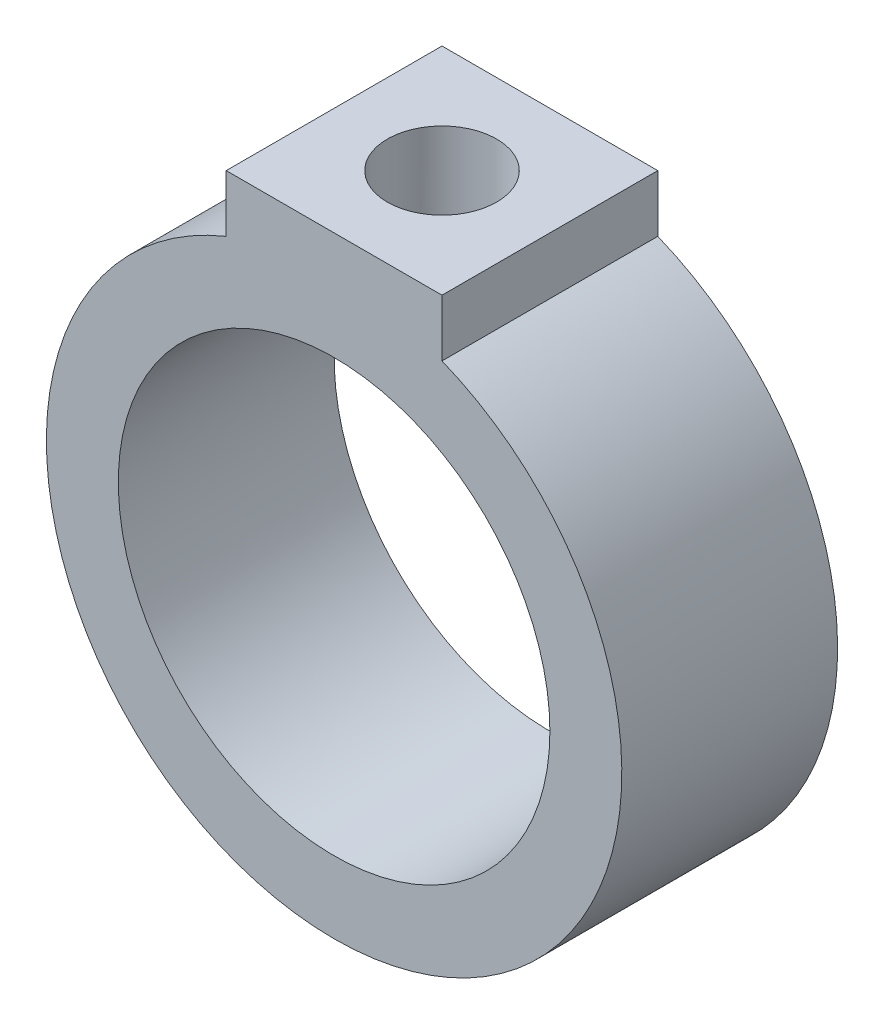
ISO-10303-21;
HEADER;
FILE_DESCRIPTION(('STEP AP214'),'2;1');
FILE_NAME('part.step','',(''),(''),'','','');
FILE_SCHEMA(('AUTOMOTIVE_DESIGN { 1 0 10303 214 1 1 1 1 }'));
ENDSEC;
DATA;
#1=APPLICATION_CONTEXT('core data for automotive mechanical design processes');
#2=APPLICATION_PROTOCOL_DEFINITION('international standard','automotive_design',2000,#1);
#3=PRODUCT_CONTEXT('',#1,'mechanical');
#4=PRODUCT('Part','Part','',(#3));
#5=PRODUCT_RELATED_PRODUCT_CATEGORY('part','',(#4));
#6=PRODUCT_DEFINITION_FORMATION('','',#4);
#7=PRODUCT_DEFINITION_CONTEXT('part definition',#1,'design');
#8=PRODUCT_DEFINITION('design','',#6,#7);
#9=PRODUCT_DEFINITION_SHAPE('','',#8);
#10=(LENGTH_UNIT() NAMED_UNIT(*) SI_UNIT(.MILLI.,.METRE.));
#11=(NAMED_UNIT(*) PLANE_ANGLE_UNIT() SI_UNIT($,.RADIAN.));
#12=(NAMED_UNIT(*) SI_UNIT($,.STERADIAN.) SOLID_ANGLE_UNIT());
#13=UNCERTAINTY_MEASURE_WITH_UNIT(LENGTH_MEASURE(1.E-05),#10,'distance_accuracy_value','');
#14=(GEOMETRIC_REPRESENTATION_CONTEXT(3) GLOBAL_UNCERTAINTY_ASSIGNED_CONTEXT((#13)) GLOBAL_UNIT_ASSIGNED_CONTEXT((#10,
#11,#12)) REPRESENTATION_CONTEXT('',''));
#15=CARTESIAN_POINT('',(0.,0.,0.));
#16=DIRECTION('',(0.,0.,1.));
#17=DIRECTION('',(1.,0.,0.));
#18=AXIS2_PLACEMENT_3D('',#15,#16,#17);
#19=CARTESIAN_POINT('',(0.,0.,9.525));
#20=DIRECTION('',(0.,0.,-1.));
#21=DIRECTION('',(-1.,0.,0.));
#22=AXIS2_PLACEMENT_3D('',#19,#20,#21);
#23=CYLINDRICAL_SURFACE('',#22,25.4);
#24=DIRECTION('',(0.,0.,-1.));
#25=VECTOR('',#24,1.);
#26=CARTESIAN_POINT('',(9.525,23.5464301965287,9.525));
#27=LINE('',#26,#25);
#28=CARTESIAN_POINT('',(9.525,23.5464301965287,9.525));
#29=VERTEX_POINT('',#28);
#30=CARTESIAN_POINT('',(9.525,23.5464301965287,-9.525));
#31=VERTEX_POINT('',#30);
#32=EDGE_CURVE('E102',#29,#31,#27,.T.);
#33=ORIENTED_EDGE('',*,*,#32,.F.);
#34=CARTESIAN_POINT('',(0.,0.,9.525));
#35=DIRECTION('',(0.,0.,1.));
#36=DIRECTION('',(1.,0.,0.));
#37=AXIS2_PLACEMENT_3D('',#34,#35,#36);
#38=CIRCLE('',#37,25.4);
#39=CARTESIAN_POINT('',(-9.525,23.5464301965287,9.525));
#40=VERTEX_POINT('',#39);
#41=EDGE_CURVE('E11',#40,#29,#38,.T.);
#42=ORIENTED_EDGE('',*,*,#41,.F.);
#43=DIRECTION('',(0.,0.,-1.));
#44=VECTOR('',#43,1.);
#45=CARTESIAN_POINT('',(-9.525,23.5464301965287,9.525));
#46=LINE('',#45,#44);
#47=CARTESIAN_POINT('',(-9.525,23.5464301965287,-9.525));
#48=VERTEX_POINT('',#47);
#49=EDGE_CURVE('E104',#48,#40,#46,.F.);
#50=ORIENTED_EDGE('',*,*,#49,.F.);
#51=CARTESIAN_POINT('',(0.,0.,-9.525));
#52=DIRECTION('',(0.,0.,1.));
#53=DIRECTION('',(1.,0.,0.));
#54=AXIS2_PLACEMENT_3D('',#51,#52,#53);
#55=CIRCLE('',#54,25.4);
#56=EDGE_CURVE('E42',#48,#31,#55,.T.);
#57=ORIENTED_EDGE('',*,*,#56,.T.);
#58=EDGE_LOOP('',(#33,#42,#50,#57));
#59=FACE_BOUND('',#58,.T.);
#60=ADVANCED_FACE('F39',(#59),#23,.T.);
#61=CARTESIAN_POINT('',(0.,0.,9.525));
#62=DIRECTION('',(0.,0.,1.));
#63=DIRECTION('',(1.,0.,0.));
#64=AXIS2_PLACEMENT_3D('',#61,#62,#63);
#65=PLANE('',#64);
#66=CARTESIAN_POINT('',(0.,0.,9.525));
#67=DIRECTION('',(0.,0.,1.));
#68=DIRECTION('',(1.,0.,0.));
#69=AXIS2_PLACEMENT_3D('',#66,#67,#68);
#70=CIRCLE('',#69,19.05);
#71=CARTESIAN_POINT('',(19.05,0.,9.525));
#72=VERTEX_POINT('',#71);
#73=EDGE_CURVE('E127',#72,#72,#70,.T.);
#74=ORIENTED_EDGE('',*,*,#73,.F.);
#75=EDGE_LOOP('',(#74));
#76=FACE_BOUND('',#75,.T.);
#77=ORIENTED_EDGE('',*,*,#41,.T.);
#78=DIRECTION('',(0.,-1.,0.));
#79=VECTOR('',#78,1.);
#80=CARTESIAN_POINT('',(9.525,28.575,9.525));
#81=LINE('',#80,#79);
#82=CARTESIAN_POINT('',(9.525,28.575,9.525));
#83=VERTEX_POINT('',#82);
#84=EDGE_CURVE('E61',#83,#29,#81,.T.);
#85=ORIENTED_EDGE('',*,*,#84,.F.);
#86=DIRECTION('',(1.,0.,0.));
#87=VECTOR('',#86,1.);
#88=CARTESIAN_POINT('',(-9.525,28.575,9.525));
#89=LINE('',#88,#87);
#90=CARTESIAN_POINT('',(-9.525,28.575,9.525));
#91=VERTEX_POINT('',#90);
#92=EDGE_CURVE('E97',#91,#83,#89,.T.);
#93=ORIENTED_EDGE('',*,*,#92,.F.);
#94=DIRECTION('',(0.,-1.,0.));
#95=VECTOR('',#94,1.);
#96=CARTESIAN_POINT('',(-9.525,28.575,9.525));
#97=LINE('',#96,#95);
#98=EDGE_CURVE('E53',#91,#40,#97,.T.);
#99=ORIENTED_EDGE('',*,*,#98,.T.);
#100=EDGE_LOOP('',(#77,#85,#93,#99));
#101=FACE_BOUND('',#100,.T.);
#102=ADVANCED_FACE('F161',(#76,#101),#65,.T.);
#103=CARTESIAN_POINT('',(0.,0.,-9.525));
#104=DIRECTION('',(0.,0.,1.));
#105=DIRECTION('',(1.,0.,0.));
#106=AXIS2_PLACEMENT_3D('',#103,#104,#105);
#107=PLANE('',#106);
#108=CARTESIAN_POINT('',(0.,0.,-9.525));
#109=DIRECTION('',(0.,0.,1.));
#110=DIRECTION('',(1.,0.,0.));
#111=AXIS2_PLACEMENT_3D('',#108,#109,#110);
#112=CIRCLE('',#111,19.05);
#113=CARTESIAN_POINT('',(19.05,0.,-9.525));
#114=VERTEX_POINT('',#113);
#115=EDGE_CURVE('E99',#114,#114,#112,.T.);
#116=ORIENTED_EDGE('',*,*,#115,.T.);
#117=EDGE_LOOP('',(#116));
#118=FACE_BOUND('',#117,.T.);
#119=ORIENTED_EDGE('',*,*,#56,.F.);
#120=DIRECTION('',(0.,-1.,0.));
#121=VECTOR('',#120,1.);
#122=CARTESIAN_POINT('',(-9.525,28.575,-9.525));
#123=LINE('',#122,#121);
#124=CARTESIAN_POINT('',(-9.525,28.575,-9.525));
#125=VERTEX_POINT('',#124);
#126=EDGE_CURVE('E89',#125,#48,#123,.T.);
#127=ORIENTED_EDGE('',*,*,#126,.F.);
#128=DIRECTION('',(-1.,0.,0.));
#129=VECTOR('',#128,1.);
#130=CARTESIAN_POINT('',(-9.525,28.575,-9.525));
#131=LINE('',#130,#129);
#132=CARTESIAN_POINT('',(9.525,28.575,-9.525));
#133=VERTEX_POINT('',#132);
#134=EDGE_CURVE('E82',#133,#125,#131,.T.);
#135=ORIENTED_EDGE('',*,*,#134,.F.);
#136=DIRECTION('',(0.,-1.,0.));
#137=VECTOR('',#136,1.);
#138=CARTESIAN_POINT('',(9.525,28.575,-9.525));
#139=LINE('',#138,#137);
#140=EDGE_CURVE('E87',#133,#31,#139,.T.);
#141=ORIENTED_EDGE('',*,*,#140,.T.);
#142=EDGE_LOOP('',(#119,#127,#135,#141));
#143=FACE_BOUND('',#142,.T.);
#144=ADVANCED_FACE('F85',(#118,#143),#107,.F.);
#145=CARTESIAN_POINT('',(9.525,28.575,9.525));
#146=DIRECTION('',(-1.,0.,0.));
#147=DIRECTION('',(0.,0.,1.));
#148=AXIS2_PLACEMENT_3D('',#145,#146,#147);
#149=PLANE('',#148);
#150=ORIENTED_EDGE('',*,*,#84,.T.);
#151=ORIENTED_EDGE('',*,*,#32,.T.);
#152=ORIENTED_EDGE('',*,*,#140,.F.);
#153=DIRECTION('',(0.,0.,-1.));
#154=VECTOR('',#153,1.);
#155=CARTESIAN_POINT('',(9.525,28.575,9.525));
#156=LINE('',#155,#154);
#157=EDGE_CURVE('E94',#83,#133,#156,.T.);
#158=ORIENTED_EDGE('',*,*,#157,.F.);
#159=EDGE_LOOP('',(#150,#151,#152,#158));
#160=FACE_BOUND('',#159,.T.);
#161=ADVANCED_FACE('F101',(#160),#149,.F.);
#162=CARTESIAN_POINT('',(-9.525,28.575,9.525));
#163=DIRECTION('',(1.,0.,0.));
#164=DIRECTION('',(0.,0.,-1.));
#165=AXIS2_PLACEMENT_3D('',#162,#163,#164);
#166=PLANE('',#165);
#167=ORIENTED_EDGE('',*,*,#126,.T.);
#168=ORIENTED_EDGE('',*,*,#49,.T.);
#169=ORIENTED_EDGE('',*,*,#98,.F.);
#170=DIRECTION('',(0.,0.,1.));
#171=VECTOR('',#170,1.);
#172=CARTESIAN_POINT('',(-9.525,28.575,9.525));
#173=LINE('',#172,#171);
#174=EDGE_CURVE('E93',#125,#91,#173,.T.);
#175=ORIENTED_EDGE('',*,*,#174,.F.);
#176=EDGE_LOOP('',(#167,#168,#169,#175));
#177=FACE_BOUND('',#176,.T.);
#178=ADVANCED_FACE('F118',(#177),#166,.F.);
#179=CARTESIAN_POINT('',(0.,28.575,0.));
#180=DIRECTION('',(0.,-1.,0.));
#181=DIRECTION('',(0.,0.,-1.));
#182=AXIS2_PLACEMENT_3D('',#179,#180,#181);
#183=PLANE('',#182);
#184=CARTESIAN_POINT('',(0.,28.575,0.));
#185=DIRECTION('',(0.,1.,0.));
#186=DIRECTION('',(0.,0.,1.));
#187=AXIS2_PLACEMENT_3D('',#184,#185,#186);
#188=CIRCLE('',#187,4.826);
#189=CARTESIAN_POINT('',(0.,28.575,4.826));
#190=VERTEX_POINT('',#189);
#191=EDGE_CURVE('E143',#190,#190,#188,.T.);
#192=ORIENTED_EDGE('',*,*,#191,.F.);
#193=EDGE_LOOP('',(#192));
#194=FACE_BOUND('',#193,.T.);
#195=ORIENTED_EDGE('',*,*,#157,.T.);
#196=ORIENTED_EDGE('',*,*,#134,.T.);
#197=ORIENTED_EDGE('',*,*,#174,.T.);
#198=ORIENTED_EDGE('',*,*,#92,.T.);
#199=EDGE_LOOP('',(#195,#196,#197,#198));
#200=FACE_BOUND('',#199,.T.);
#201=ADVANCED_FACE('F96',(#194,#200),#183,.F.);
#202=CARTESIAN_POINT('',(0.,0.,-9.525));
#203=DIRECTION('',(0.,0.,1.));
#204=DIRECTION('',(1.,0.,0.));
#205=AXIS2_PLACEMENT_3D('',#202,#203,#204);
#206=CYLINDRICAL_SURFACE('',#205,19.05);
#207=CARTESIAN_POINT('',(0.,19.05,4.826));
#208=CARTESIAN_POINT('',(-0.266523640409036,19.0499955743465,4.82599273329499));
#209=CARTESIAN_POINT('',(-0.533127776508243,19.044351111249,4.803846975636));
#210=CARTESIAN_POINT('',(-1.05868748938051,19.0223814029259,4.71598643861751));
#211=CARTESIAN_POINT('',(-1.31763877738875,19.0060502830832,4.65024769526729));
#212=CARTESIAN_POINT('',(-1.82022799711811,18.9645145284427,4.47745169779294));
#213=CARTESIAN_POINT('',(-2.06388416581402,18.939320707279,4.37044478088754));
#214=CARTESIAN_POINT('',(-2.52978809364021,18.8827386652934,4.11832893355444));
#215=CARTESIAN_POINT('',(-2.7520349901974,18.8513501950461,3.97321846882322));
#216=CARTESIAN_POINT('',(-3.17350203867229,18.7850421547524,3.64578014516583));
#217=CARTESIAN_POINT('',(-3.3722059958357,18.7500669399191,3.46279909738051));
#218=CARTESIAN_POINT('',(-3.73645917095423,18.6808945703291,3.06621181922272));
#219=CARTESIAN_POINT('',(-3.90200454663631,18.6466975061477,2.85260204464097));
#220=CARTESIAN_POINT('',(-4.19768639922928,18.5823907746642,2.39679096538873));
#221=CARTESIAN_POINT('',(-4.32724224274738,18.5523516655455,2.15420214625901));
#222=CARTESIAN_POINT('',(-4.54353230146951,18.5005747921464,1.64980403094508));
#223=CARTESIAN_POINT('',(-4.63027356527884,18.4788356615661,1.38799790668209));
#224=CARTESIAN_POINT('',(-4.75670501962698,18.44669254224,0.858281034989654));
#225=CARTESIAN_POINT('',(-4.79732487308754,18.4360649422282,0.590606064146242));
#226=CARTESIAN_POINT('',(-4.83325673322292,18.4266790944644,0.0520461999381361));
#227=CARTESIAN_POINT('',(-4.82857632207353,18.4279188604001,-0.218838148673372));
#228=CARTESIAN_POINT('',(-4.77478153005855,18.4419268266082,-0.748976890207447));
#229=CARTESIAN_POINT('',(-4.7267782589243,18.4544067326209,-1.00835284254054));
#230=CARTESIAN_POINT('',(-4.58947423715228,18.4890289436535,-1.51524447708414));
#231=CARTESIAN_POINT('',(-4.50017047419361,18.5111719534614,-1.76275929272916));
#232=CARTESIAN_POINT('',(-4.28186174459625,18.5628878465075,-2.24186574134988));
#233=CARTESIAN_POINT('',(-4.15245621860907,18.592535112955,-2.47326648947353));
#234=CARTESIAN_POINT('',(-3.85789731173015,18.6558774212707,-2.91146566062787));
#235=CARTESIAN_POINT('',(-3.69273752131787,18.6895731884146,-3.11825966219426));
#236=CARTESIAN_POINT('',(-3.32561742891671,18.7584270035222,-3.50773888487321));
#237=CARTESIAN_POINT('',(-3.12272037220959,18.7935989633955,-3.68953980373175));
#238=CARTESIAN_POINT('',(-2.68889519307718,18.8605525278951,-4.01670626821268));
#239=CARTESIAN_POINT('',(-2.45796616891404,18.8923340233944,-4.16207064127582));
#240=CARTESIAN_POINT('',(-1.97334955444475,18.9490909123743,-4.41257487796862));
#241=CARTESIAN_POINT('',(-1.71958295425139,18.9740413680249,-4.51756790879387));
#242=CARTESIAN_POINT('',(-1.19722795564139,19.0141438237889,-4.68315587412816));
#243=CARTESIAN_POINT('',(-0.928642482002606,19.0292977499727,-4.74375953622891));
#244=CARTESIAN_POINT('',(-0.391831819254896,19.0478134612873,-4.81749053907978));
#245=CARTESIAN_POINT('',(-0.12378204576256,19.0514741887354,-4.83182173155236));
#246=CARTESIAN_POINT('',(0.410886775311175,19.0474440488914,-4.8159072694443));
#247=CARTESIAN_POINT('',(0.677505953081034,19.0397542327396,-4.78566574261178));
#248=CARTESIAN_POINT('',(1.19753978279255,19.0140789191575,-4.68245568890631));
#249=CARTESIAN_POINT('',(1.45109391518146,18.9962524625134,-4.61014679027648));
#250=CARTESIAN_POINT('',(1.94245802266993,18.9523154322987,-4.42561046903715));
#251=CARTESIAN_POINT('',(2.18026638051197,18.926204009365,-4.31337895347351));
#252=CARTESIAN_POINT('',(2.63815632732118,18.867880471571,-4.04986977308212));
#253=CARTESIAN_POINT('',(2.85783875530978,18.8355664106409,-3.89792161243601));
#254=CARTESIAN_POINT('',(3.26901378058973,18.7685780157587,-3.56014663690651));
#255=CARTESIAN_POINT('',(3.46050136439094,18.7339032636376,-3.37431380991055));
#256=CARTESIAN_POINT('',(3.81483413286365,18.6650207446488,-2.96844912958439));
#257=CARTESIAN_POINT('',(3.97683382501421,18.6308468872863,-2.74767211000414));
#258=CARTESIAN_POINT('',(4.2614881323312,18.5678096927747,-2.2813591414771));
#259=CARTESIAN_POINT('',(4.3841444814734,18.5389461216096,-2.03582428430741));
#260=CARTESIAN_POINT('',(4.58571306985039,18.4901188818406,-1.52826920764204));
#261=CARTESIAN_POINT('',(4.6648841072527,18.4701027013277,-1.26635708403455));
#262=CARTESIAN_POINT('',(4.77790476647726,18.4411928361728,-0.732353075660017));
#263=CARTESIAN_POINT('',(4.81176461913278,18.4322966407742,-0.460263503131106));
#264=CARTESIAN_POINT('',(4.83265643992713,18.4268290082206,0.0777580671646871));
#265=CARTESIAN_POINT('',(4.82104118270001,18.4299015171512,0.343634746652316));
#266=CARTESIAN_POINT('',(4.75441673100058,18.4471998567901,0.869505699878315));
#267=CARTESIAN_POINT('',(4.69940845438036,18.4614254515874,1.12950009791945));
#268=CARTESIAN_POINT('',(4.5483073852537,18.499225960704,1.63471013975224));
#269=CARTESIAN_POINT('',(4.452474755693,18.5227416041969,1.88000833560273));
#270=CARTESIAN_POINT('',(4.22265020856008,18.576479504921,2.35122208373966));
#271=CARTESIAN_POINT('',(4.08865285871293,18.6067027167563,2.57713487079235));
#272=CARTESIAN_POINT('',(3.78208916366239,18.6714602406322,3.00968648388306));
#273=CARTESIAN_POINT('',(3.60858717241005,18.7060882316093,3.21564826758761));
#274=CARTESIAN_POINT('',(3.2297540590414,18.7752016230556,3.59597365441532));
#275=CARTESIAN_POINT('',(3.02441535749522,18.809686987557,3.77032971160241));
#276=CARTESIAN_POINT('',(2.58309455813378,18.8754008772637,4.08568465531404));
#277=CARTESIAN_POINT('',(2.34661043011591,18.9065562811935,4.22599739605019));
#278=CARTESIAN_POINT('',(1.8526399808081,18.9613231988472,4.46465275891674));
#279=CARTESIAN_POINT('',(1.59516855786005,18.9849400064793,4.56302484983984));
#280=CARTESIAN_POINT('',(1.11520835263359,19.0185620114703,4.70074739682113));
#281=CARTESIAN_POINT('',(0.894965319598651,19.0302693276148,4.74761414880409));
#282=CARTESIAN_POINT('',(0.449833723906643,19.0459898838031,4.8102422810658));
#283=CARTESIAN_POINT('',(0.224945531835067,19.0500037352446,4.82600613308755));
#284=CARTESIAN_POINT('',(0.,19.05,4.826));
#285=B_SPLINE_CURVE_WITH_KNOTS('',3,(#207,#208,#209,#210,#211,#212,#213,#214,#215,#216,#217,
#218,#219,#220,#221,#222,#223,#224,#225,#226,#227,#228,#229,#230,#231,#232,#233,#234,#235,#236,
#237,#238,#239,#240,#241,#242,#243,#244,#245,#246,#247,#248,#249,#250,#251,#252,#253,#254,#255,
#256,#257,#258,#259,#260,#261,#262,#263,#264,#265,#266,#267,#268,#269,#270,#271,#272,#273,#274,
#275,#276,#277,#278,#279,#280,#281,#282,#283,#284),.UNSPECIFIED.,.T.,.F.,(4,2,2,2,2,2,2,2,2,2,2,
2,2,2,2,2,2,2,2,2,2,2,2,2,2,2,2,2,2,2,2,2,2,2,2,2,2,2,4),(0.,0.79874646425257,1.59793238081391,
2.39614655079409,3.19439286714248,4.00776667524491,4.82123467913141,5.64715125019084,
6.47293180442399,7.2817540676782,8.09044095586212,8.87895891616206,9.66753439741959,
10.4642553513942,11.261119248717,12.0813397132549,12.9015865698021,13.7247891103242,
14.5478297538458,15.3492775093103,16.1506510497243,16.9397851295146,17.7290001363879,
18.5325118624158,19.3361662934633,20.1601169138194,20.9840312152799,21.8029874290033,
22.6217586990086,23.4163612659627,24.2109470258801,25.0005431153738,25.7902516502998,
26.6010800825706,27.4121018476522,28.2383181091766,29.0639528851359,29.7381472205415,
30.4122879756615),.UNSPECIFIED.);
#286=CARTESIAN_POINT('',(0.,19.05,4.826));
#287=VERTEX_POINT('',#286);
#288=EDGE_CURVE('E131',#287,#287,#285,.T.);
#289=ORIENTED_EDGE('',*,*,#288,.F.);
#290=EDGE_LOOP('',(#289));
#291=FACE_BOUND('',#290,.T.);
#292=ORIENTED_EDGE('',*,*,#115,.F.);
#293=EDGE_LOOP('',(#292));
#294=FACE_BOUND('',#293,.T.);
#295=ORIENTED_EDGE('',*,*,#73,.T.);
#296=EDGE_LOOP('',(#295));
#297=FACE_BOUND('',#296,.T.);
#298=ADVANCED_FACE('F149',(#291,#294,#297),#206,.F.);
#299=CARTESIAN_POINT('',(0.,-25.401,0.));
#300=DIRECTION('',(0.,1.,0.));
#301=DIRECTION('',(0.,0.,1.));
#302=AXIS2_PLACEMENT_3D('',#299,#300,#301);
#303=CYLINDRICAL_SURFACE('',#302,4.826);
#304=ORIENTED_EDGE('',*,*,#288,.T.);
#305=EDGE_LOOP('',(#304));
#306=FACE_BOUND('',#305,.T.);
#307=ORIENTED_EDGE('',*,*,#191,.T.);
#308=EDGE_LOOP('',(#307));
#309=FACE_BOUND('',#308,.T.);
#310=ADVANCED_FACE('F144',(#306,#309),#303,.F.);
#311=CLOSED_SHELL('',(#60,#102,#144,#161,#178,#201,#298,#310));
#312=MANIFOLD_SOLID_BREP('B2',#311);
#313=ADVANCED_BREP_SHAPE_REPRESENTATION('',(#18,#312),#14);
#314=SHAPE_DEFINITION_REPRESENTATION(#9,#313);
ENDSEC;
END-ISO-10303-21;
